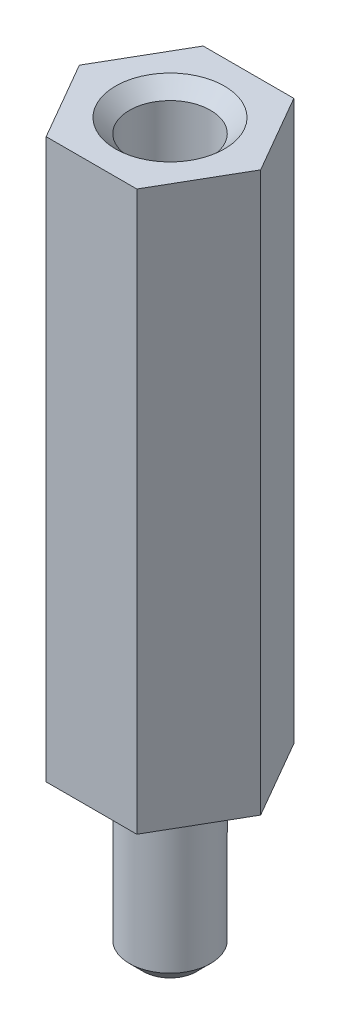
ISO-10303-21;
HEADER;
FILE_DESCRIPTION(('STEP AP214'),'2;1');
FILE_NAME('part.step','',(''),(''),'','','');
FILE_SCHEMA(('AUTOMOTIVE_DESIGN { 1 0 10303 214 1 1 1 1 }'));
ENDSEC;
DATA;
#1=APPLICATION_CONTEXT('core data for automotive mechanical design processes');
#2=APPLICATION_PROTOCOL_DEFINITION('international standard','automotive_design',2000,#1);
#3=PRODUCT_CONTEXT('',#1,'mechanical');
#4=PRODUCT('Part','Part','',(#3));
#5=PRODUCT_RELATED_PRODUCT_CATEGORY('part','',(#4));
#6=PRODUCT_DEFINITION_FORMATION('','',#4);
#7=PRODUCT_DEFINITION_CONTEXT('part definition',#1,'design');
#8=PRODUCT_DEFINITION('design','',#6,#7);
#9=PRODUCT_DEFINITION_SHAPE('','',#8);
#10=(LENGTH_UNIT() NAMED_UNIT(*) SI_UNIT(.MILLI.,.METRE.));
#11=(NAMED_UNIT(*) PLANE_ANGLE_UNIT() SI_UNIT($,.RADIAN.));
#12=(NAMED_UNIT(*) SI_UNIT($,.STERADIAN.) SOLID_ANGLE_UNIT());
#13=UNCERTAINTY_MEASURE_WITH_UNIT(LENGTH_MEASURE(1.E-05),#10,'distance_accuracy_value','');
#14=(GEOMETRIC_REPRESENTATION_CONTEXT(3) GLOBAL_UNCERTAINTY_ASSIGNED_CONTEXT((#13)) GLOBAL_UNIT_ASSIGNED_CONTEXT((#10,
#11,#12)) REPRESENTATION_CONTEXT('',''));
#15=CARTESIAN_POINT('',(0.,0.,0.));
#16=DIRECTION('',(0.,0.,1.));
#17=DIRECTION('',(1.,0.,0.));
#18=AXIS2_PLACEMENT_3D('',#15,#16,#17);
#19=CARTESIAN_POINT('',(-1.62235425642285,0.,2.81));
#20=DIRECTION('',(0.,0.,1.));
#21=DIRECTION('',(1.,0.,0.));
#22=AXIS2_PLACEMENT_3D('',#19,#20,#21);
#23=PLANE('',#22);
#24=DIRECTION('',(1.,0.,0.));
#25=VECTOR('',#24,1.);
#26=CARTESIAN_POINT('',(-1.62235425642285,20.,2.81));
#27=LINE('',#26,#25);
#28=CARTESIAN_POINT('',(-1.62235425642285,20.,2.81));
#29=VERTEX_POINT('',#28);
#30=CARTESIAN_POINT('',(1.62235425642285,20.,2.81));
#31=VERTEX_POINT('',#30);
#32=EDGE_CURVE('E124',#29,#31,#27,.T.);
#33=ORIENTED_EDGE('',*,*,#32,.F.);
#34=DIRECTION('',(0.,1.,0.));
#35=VECTOR('',#34,1.);
#36=CARTESIAN_POINT('',(-1.62235425642285,0.,2.81));
#37=LINE('',#36,#35);
#38=CARTESIAN_POINT('',(-1.62235425642285,0.,2.81));
#39=VERTEX_POINT('',#38);
#40=EDGE_CURVE('E53',#39,#29,#37,.T.);
#41=ORIENTED_EDGE('',*,*,#40,.F.);
#42=DIRECTION('',(1.,0.,0.));
#43=VECTOR('',#42,1.);
#44=CARTESIAN_POINT('',(-1.62235425642285,0.,2.81));
#45=LINE('',#44,#43);
#46=CARTESIAN_POINT('',(1.62235425642285,0.,2.81));
#47=VERTEX_POINT('',#46);
#48=EDGE_CURVE('E140',#39,#47,#45,.T.);
#49=ORIENTED_EDGE('',*,*,#48,.T.);
#50=DIRECTION('',(0.,1.,0.));
#51=VECTOR('',#50,1.);
#52=CARTESIAN_POINT('',(1.62235425642285,0.,2.81));
#53=LINE('',#52,#51);
#54=EDGE_CURVE('E88',#47,#31,#53,.T.);
#55=ORIENTED_EDGE('',*,*,#54,.T.);
#56=EDGE_LOOP('',(#33,#41,#49,#55));
#57=FACE_BOUND('',#56,.T.);
#58=ADVANCED_FACE('F35',(#57),#23,.T.);
#59=CARTESIAN_POINT('',(-3.2447085128457,0.,0.));
#60=DIRECTION('',(-0.866025403784439,0.,0.5));
#61=DIRECTION('',(0.5,0.,0.866025403784439));
#62=AXIS2_PLACEMENT_3D('',#59,#60,#61);
#63=PLANE('',#62);
#64=DIRECTION('',(0.5,0.,0.866025403784438));
#65=VECTOR('',#64,1.);
#66=CARTESIAN_POINT('',(-3.2447085128457,20.,0.));
#67=LINE('',#66,#65);
#68=CARTESIAN_POINT('',(-3.2447085128457,20.,0.));
#69=VERTEX_POINT('',#68);
#70=EDGE_CURVE('E137',#69,#29,#67,.T.);
#71=ORIENTED_EDGE('',*,*,#70,.F.);
#72=DIRECTION('',(0.,1.,0.));
#73=VECTOR('',#72,1.);
#74=CARTESIAN_POINT('',(-3.2447085128457,0.,0.));
#75=LINE('',#74,#73);
#76=CARTESIAN_POINT('',(-3.2447085128457,0.,0.));
#77=VERTEX_POINT('',#76);
#78=EDGE_CURVE('E76',#77,#69,#75,.T.);
#79=ORIENTED_EDGE('',*,*,#78,.F.);
#80=DIRECTION('',(0.5,0.,0.866025403784438));
#81=VECTOR('',#80,1.);
#82=CARTESIAN_POINT('',(-3.2447085128457,0.,0.));
#83=LINE('',#82,#81);
#84=EDGE_CURVE('E114',#77,#39,#83,.T.);
#85=ORIENTED_EDGE('',*,*,#84,.T.);
#86=ORIENTED_EDGE('',*,*,#40,.T.);
#87=EDGE_LOOP('',(#71,#79,#85,#86));
#88=FACE_BOUND('',#87,.T.);
#89=ADVANCED_FACE('F167',(#88),#63,.T.);
#90=CARTESIAN_POINT('',(-1.62235425642285,0.,-2.81));
#91=DIRECTION('',(-0.866025403784438,0.,-0.5));
#92=DIRECTION('',(-0.5,0.,0.866025403784438));
#93=AXIS2_PLACEMENT_3D('',#90,#91,#92);
#94=PLANE('',#93);
#95=DIRECTION('',(-0.5,0.,0.866025403784438));
#96=VECTOR('',#95,1.);
#97=CARTESIAN_POINT('',(-1.62235425642285,20.,-2.81));
#98=LINE('',#97,#96);
#99=CARTESIAN_POINT('',(-1.62235425642285,20.,-2.81));
#100=VERTEX_POINT('',#99);
#101=EDGE_CURVE('E101',#100,#69,#98,.T.);
#102=ORIENTED_EDGE('',*,*,#101,.F.);
#103=DIRECTION('',(0.,1.,0.));
#104=VECTOR('',#103,1.);
#105=CARTESIAN_POINT('',(-1.62235425642285,0.,-2.81));
#106=LINE('',#105,#104);
#107=CARTESIAN_POINT('',(-1.62235425642285,0.,-2.81));
#108=VERTEX_POINT('',#107);
#109=EDGE_CURVE('E96',#108,#100,#106,.T.);
#110=ORIENTED_EDGE('',*,*,#109,.F.);
#111=DIRECTION('',(-0.5,0.,0.866025403784438));
#112=VECTOR('',#111,1.);
#113=CARTESIAN_POINT('',(-1.62235425642285,0.,-2.81));
#114=LINE('',#113,#112);
#115=EDGE_CURVE('E99',#108,#77,#114,.T.);
#116=ORIENTED_EDGE('',*,*,#115,.T.);
#117=ORIENTED_EDGE('',*,*,#78,.T.);
#118=EDGE_LOOP('',(#102,#110,#116,#117));
#119=FACE_BOUND('',#118,.T.);
#120=ADVANCED_FACE('F98',(#119),#94,.T.);
#121=CARTESIAN_POINT('',(1.62235425642285,0.,-2.81));
#122=DIRECTION('',(0.,0.,-1.));
#123=DIRECTION('',(-1.,0.,0.));
#124=AXIS2_PLACEMENT_3D('',#121,#122,#123);
#125=PLANE('',#124);
#126=DIRECTION('',(-1.,0.,0.));
#127=VECTOR('',#126,1.);
#128=CARTESIAN_POINT('',(1.62235425642285,20.,-2.81));
#129=LINE('',#128,#127);
#130=CARTESIAN_POINT('',(1.62235425642285,20.,-2.81));
#131=VERTEX_POINT('',#130);
#132=EDGE_CURVE('E134',#131,#100,#129,.T.);
#133=ORIENTED_EDGE('',*,*,#132,.F.);
#134=DIRECTION('',(0.,1.,0.));
#135=VECTOR('',#134,1.);
#136=CARTESIAN_POINT('',(1.62235425642285,0.,-2.81));
#137=LINE('',#136,#135);
#138=CARTESIAN_POINT('',(1.62235425642285,0.,-2.81));
#139=VERTEX_POINT('',#138);
#140=EDGE_CURVE('E106',#139,#131,#137,.T.);
#141=ORIENTED_EDGE('',*,*,#140,.F.);
#142=DIRECTION('',(-1.,0.,0.));
#143=VECTOR('',#142,1.);
#144=CARTESIAN_POINT('',(1.62235425642285,0.,-2.81));
#145=LINE('',#144,#143);
#146=EDGE_CURVE('E112',#139,#108,#145,.T.);
#147=ORIENTED_EDGE('',*,*,#146,.T.);
#148=ORIENTED_EDGE('',*,*,#109,.T.);
#149=EDGE_LOOP('',(#133,#141,#147,#148));
#150=FACE_BOUND('',#149,.T.);
#151=ADVANCED_FACE('F116',(#150),#125,.T.);
#152=CARTESIAN_POINT('',(3.2447085128457,0.,0.));
#153=DIRECTION('',(0.866025403784438,0.,-0.5));
#154=DIRECTION('',(-0.5,0.,-0.866025403784439));
#155=AXIS2_PLACEMENT_3D('',#152,#153,#154);
#156=PLANE('',#155);
#157=DIRECTION('',(-0.5,0.,-0.866025403784438));
#158=VECTOR('',#157,1.);
#159=CARTESIAN_POINT('',(3.2447085128457,20.,0.));
#160=LINE('',#159,#158);
#161=CARTESIAN_POINT('',(3.2447085128457,20.,0.));
#162=VERTEX_POINT('',#161);
#163=EDGE_CURVE('E131',#162,#131,#160,.T.);
#164=ORIENTED_EDGE('',*,*,#163,.F.);
#165=DIRECTION('',(0.,1.,0.));
#166=VECTOR('',#165,1.);
#167=CARTESIAN_POINT('',(3.2447085128457,0.,0.));
#168=LINE('',#167,#166);
#169=CARTESIAN_POINT('',(3.2447085128457,0.,0.));
#170=VERTEX_POINT('',#169);
#171=EDGE_CURVE('E145',#170,#162,#168,.T.);
#172=ORIENTED_EDGE('',*,*,#171,.F.);
#173=DIRECTION('',(-0.5,0.,-0.866025403784438));
#174=VECTOR('',#173,1.);
#175=CARTESIAN_POINT('',(3.2447085128457,0.,0.));
#176=LINE('',#175,#174);
#177=EDGE_CURVE('E117',#170,#139,#176,.T.);
#178=ORIENTED_EDGE('',*,*,#177,.T.);
#179=ORIENTED_EDGE('',*,*,#140,.T.);
#180=EDGE_LOOP('',(#164,#172,#178,#179));
#181=FACE_BOUND('',#180,.T.);
#182=ADVANCED_FACE('F182',(#181),#156,.T.);
#183=CARTESIAN_POINT('',(1.62235425642285,0.,2.81));
#184=DIRECTION('',(0.866025403784438,0.,0.5));
#185=DIRECTION('',(0.5,0.,-0.866025403784438));
#186=AXIS2_PLACEMENT_3D('',#183,#184,#185);
#187=PLANE('',#186);
#188=DIRECTION('',(0.5,0.,-0.866025403784438));
#189=VECTOR('',#188,1.);
#190=CARTESIAN_POINT('',(1.62235425642285,20.,2.81));
#191=LINE('',#190,#189);
#192=EDGE_CURVE('E127',#31,#162,#191,.T.);
#193=ORIENTED_EDGE('',*,*,#192,.F.);
#194=ORIENTED_EDGE('',*,*,#54,.F.);
#195=DIRECTION('',(0.5,0.,-0.866025403784438));
#196=VECTOR('',#195,1.);
#197=CARTESIAN_POINT('',(1.62235425642285,0.,2.81));
#198=LINE('',#197,#196);
#199=EDGE_CURVE('E119',#47,#170,#198,.T.);
#200=ORIENTED_EDGE('',*,*,#199,.T.);
#201=ORIENTED_EDGE('',*,*,#171,.T.);
#202=EDGE_LOOP('',(#193,#194,#200,#201));
#203=FACE_BOUND('',#202,.T.);
#204=ADVANCED_FACE('F174',(#203),#187,.T.);
#205=CARTESIAN_POINT('',(0.,0.,0.));
#206=DIRECTION('',(0.,1.,0.));
#207=DIRECTION('',(0.,0.,1.));
#208=AXIS2_PLACEMENT_3D('',#205,#206,#207);
#209=PLANE('',#208);
#210=CARTESIAN_POINT('',(0.,0.,0.));
#211=DIRECTION('',(0.,1.,0.));
#212=DIRECTION('',(0.,0.,1.));
#213=AXIS2_PLACEMENT_3D('',#210,#211,#212);
#214=CIRCLE('',#213,1.45);
#215=CARTESIAN_POINT('',(0.,0.,1.45));
#216=VERTEX_POINT('',#215);
#217=EDGE_CURVE('E128',#216,#216,#214,.T.);
#218=ORIENTED_EDGE('',*,*,#217,.T.);
#219=EDGE_LOOP('',(#218));
#220=FACE_BOUND('',#219,.T.);
#221=ORIENTED_EDGE('',*,*,#48,.F.);
#222=ORIENTED_EDGE('',*,*,#84,.F.);
#223=ORIENTED_EDGE('',*,*,#115,.F.);
#224=ORIENTED_EDGE('',*,*,#146,.F.);
#225=ORIENTED_EDGE('',*,*,#177,.F.);
#226=ORIENTED_EDGE('',*,*,#199,.F.);
#227=EDGE_LOOP('',(#221,#222,#223,#224,#225,#226));
#228=FACE_BOUND('',#227,.T.);
#229=ADVANCED_FACE('F110',(#220,#228),#209,.F.);
#230=CARTESIAN_POINT('',(0.,20.,0.));
#231=DIRECTION('',(0.,1.,0.));
#232=DIRECTION('',(0.,0.,1.));
#233=AXIS2_PLACEMENT_3D('',#230,#231,#232);
#234=PLANE('',#233);
#235=CARTESIAN_POINT('',(0.,20.,0.));
#236=DIRECTION('',(0.,1.,0.));
#237=DIRECTION('',(0.,0.,1.));
#238=AXIS2_PLACEMENT_3D('',#235,#236,#237);
#239=CIRCLE('',#238,1.95);
#240=CARTESIAN_POINT('',(0.,20.,1.95));
#241=VERTEX_POINT('',#240);
#242=EDGE_CURVE('E11',#241,#241,#239,.F.);
#243=ORIENTED_EDGE('',*,*,#242,.T.);
#244=EDGE_LOOP('',(#243));
#245=FACE_BOUND('',#244,.T.);
#246=ORIENTED_EDGE('',*,*,#32,.T.);
#247=ORIENTED_EDGE('',*,*,#192,.T.);
#248=ORIENTED_EDGE('',*,*,#163,.T.);
#249=ORIENTED_EDGE('',*,*,#132,.T.);
#250=ORIENTED_EDGE('',*,*,#101,.T.);
#251=ORIENTED_EDGE('',*,*,#70,.T.);
#252=EDGE_LOOP('',(#246,#247,#248,#249,#250,#251));
#253=FACE_BOUND('',#252,.T.);
#254=ADVANCED_FACE('F190',(#245,#253),#234,.T.);
#255=CARTESIAN_POINT('',(0.,-6.,0.));
#256=DIRECTION('',(0.,1.,0.));
#257=DIRECTION('',(0.,0.,1.));
#258=AXIS2_PLACEMENT_3D('',#255,#256,#257);
#259=CYLINDRICAL_SURFACE('',#258,1.45);
#260=CARTESIAN_POINT('',(0.,-5.50000000000001,0.));
#261=DIRECTION('',(0.,-1.,0.));
#262=DIRECTION('',(0.,0.,-1.));
#263=AXIS2_PLACEMENT_3D('',#260,#261,#262);
#264=CIRCLE('',#263,1.45);
#265=CARTESIAN_POINT('',(0.,-5.50000000000001,-1.45));
#266=VERTEX_POINT('',#265);
#267=EDGE_CURVE('E142',#266,#266,#264,.F.);
#268=ORIENTED_EDGE('',*,*,#267,.T.);
#269=EDGE_LOOP('',(#268));
#270=FACE_BOUND('',#269,.T.);
#271=ORIENTED_EDGE('',*,*,#217,.F.);
#272=EDGE_LOOP('',(#271));
#273=FACE_BOUND('',#272,.T.);
#274=ADVANCED_FACE('F193',(#270,#273),#259,.T.);
#275=CARTESIAN_POINT('',(1.45,-6.,0.));
#276=DIRECTION('',(0.,-1.,0.));
#277=DIRECTION('',(0.,0.,-1.));
#278=AXIS2_PLACEMENT_3D('',#275,#276,#277);
#279=PLANE('',#278);
#280=CARTESIAN_POINT('',(0.,-6.,0.));
#281=DIRECTION('',(0.,-1.,0.));
#282=DIRECTION('',(0.,0.,-1.));
#283=AXIS2_PLACEMENT_3D('',#280,#281,#282);
#284=CIRCLE('',#283,0.950000000000003);
#285=CARTESIAN_POINT('',(0.,-6.,-0.950000000000003));
#286=VERTEX_POINT('',#285);
#287=EDGE_CURVE('E150',#286,#286,#284,.T.);
#288=ORIENTED_EDGE('',*,*,#287,.T.);
#289=EDGE_LOOP('',(#288));
#290=FACE_BOUND('',#289,.T.);
#291=ADVANCED_FACE('F200',(#290),#279,.T.);
#292=CARTESIAN_POINT('',(0.,15.,0.));
#293=DIRECTION('',(0.,-1.,0.));
#294=DIRECTION('',(0.,0.,-1.));
#295=AXIS2_PLACEMENT_3D('',#292,#293,#294);
#296=PLANE('',#295);
#297=CARTESIAN_POINT('',(0.,15.,0.));
#298=DIRECTION('',(0.,1.,0.));
#299=DIRECTION('',(0.,0.,1.));
#300=AXIS2_PLACEMENT_3D('',#297,#298,#299);
#301=CIRCLE('',#300,1.44999999999999);
#302=CARTESIAN_POINT('',(0.,15.,1.44999999999999));
#303=VERTEX_POINT('',#302);
#304=EDGE_CURVE('E292',#303,#303,#301,.T.);
#305=ORIENTED_EDGE('',*,*,#304,.T.);
#306=EDGE_LOOP('',(#305));
#307=FACE_BOUND('',#306,.T.);
#308=ADVANCED_FACE('F204',(#307),#296,.F.);
#309=CARTESIAN_POINT('',(0.,20.,0.));
#310=DIRECTION('',(0.,1.,0.));
#311=DIRECTION('',(0.,0.,1.));
#312=AXIS2_PLACEMENT_3D('',#309,#310,#311);
#313=CYLINDRICAL_SURFACE('',#312,1.44999999999999);
#314=CARTESIAN_POINT('',(0.,19.5,0.));
#315=DIRECTION('',(0.,1.,0.));
#316=DIRECTION('',(0.,0.,1.));
#317=AXIS2_PLACEMENT_3D('',#314,#315,#316);
#318=CIRCLE('',#317,1.44999999999999);
#319=CARTESIAN_POINT('',(0.,19.5,1.44999999999999));
#320=VERTEX_POINT('',#319);
#321=EDGE_CURVE('E45',#320,#320,#318,.T.);
#322=ORIENTED_EDGE('',*,*,#321,.T.);
#323=EDGE_LOOP('',(#322));
#324=FACE_BOUND('',#323,.T.);
#325=ORIENTED_EDGE('',*,*,#304,.F.);
#326=EDGE_LOOP('',(#325));
#327=FACE_BOUND('',#326,.T.);
#328=ADVANCED_FACE('F155',(#324,#327),#313,.F.);
#329=CARTESIAN_POINT('',(0.,-5.50000000000001,0.));
#330=DIRECTION('',(0.,1.,0.));
#331=DIRECTION('',(0.,0.,1.));
#332=AXIS2_PLACEMENT_3D('',#329,#330,#331);
#333=CONICAL_SURFACE('',#332,1.45,0.785398163397458);
#334=ORIENTED_EDGE('',*,*,#287,.F.);
#335=EDGE_LOOP('',(#334));
#336=FACE_BOUND('',#335,.T.);
#337=ORIENTED_EDGE('',*,*,#267,.F.);
#338=EDGE_LOOP('',(#337));
#339=FACE_BOUND('',#338,.T.);
#340=ADVANCED_FACE('F159',(#336,#339),#333,.T.);
#341=CARTESIAN_POINT('',(0.,19.5,0.));
#342=DIRECTION('',(0.,1.,0.));
#343=DIRECTION('',(0.,0.,1.));
#344=AXIS2_PLACEMENT_3D('',#341,#342,#343);
#345=CONICAL_SURFACE('',#344,1.44999999999999,0.785398163397463);
#346=ORIENTED_EDGE('',*,*,#242,.F.);
#347=EDGE_LOOP('',(#346));
#348=FACE_BOUND('',#347,.T.);
#349=ORIENTED_EDGE('',*,*,#321,.F.);
#350=EDGE_LOOP('',(#349));
#351=FACE_BOUND('',#350,.T.);
#352=ADVANCED_FACE('F38',(#348,#351),#345,.F.);
#353=CLOSED_SHELL('',(#58,#89,#120,#151,#182,#204,#229,#254,#274,#291,#308,#328,#340,#352));
#354=MANIFOLD_SOLID_BREP('B2',#353);
#355=ADVANCED_BREP_SHAPE_REPRESENTATION('',(#18,#354),#14);
#356=SHAPE_DEFINITION_REPRESENTATION(#9,#355);
ENDSEC;
END-ISO-10303-21;
